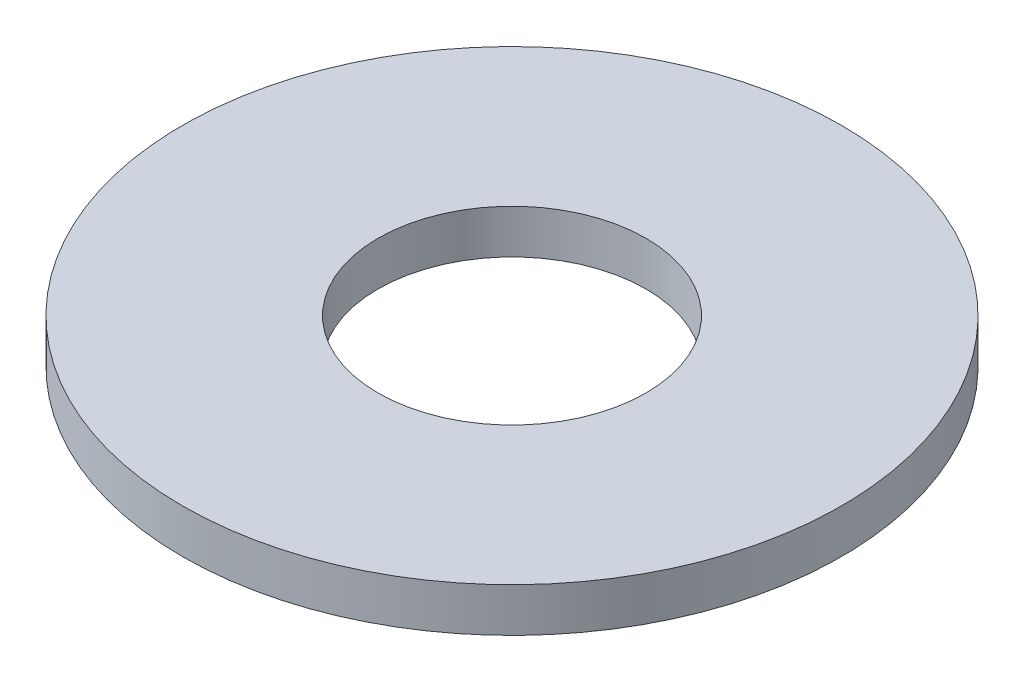
ISO-10303-21;
HEADER;
FILE_DESCRIPTION(('STEP AP214'),'2;1');
FILE_NAME('part.step','',(''),(''),'','','');
FILE_SCHEMA(('AUTOMOTIVE_DESIGN { 1 0 10303 214 1 1 1 1 }'));
ENDSEC;
DATA;
#1=APPLICATION_CONTEXT('core data for automotive mechanical design processes');
#2=APPLICATION_PROTOCOL_DEFINITION('international standard','automotive_design',2000,#1);
#3=PRODUCT_CONTEXT('',#1,'mechanical');
#4=PRODUCT('Part','Part','',(#3));
#5=PRODUCT_RELATED_PRODUCT_CATEGORY('part','',(#4));
#6=PRODUCT_DEFINITION_FORMATION('','',#4);
#7=PRODUCT_DEFINITION_CONTEXT('part definition',#1,'design');
#8=PRODUCT_DEFINITION('design','',#6,#7);
#9=PRODUCT_DEFINITION_SHAPE('','',#8);
#10=(LENGTH_UNIT() NAMED_UNIT(*) SI_UNIT(.MILLI.,.METRE.));
#11=(NAMED_UNIT(*) PLANE_ANGLE_UNIT() SI_UNIT($,.RADIAN.));
#12=(NAMED_UNIT(*) SI_UNIT($,.STERADIAN.) SOLID_ANGLE_UNIT());
#13=UNCERTAINTY_MEASURE_WITH_UNIT(LENGTH_MEASURE(1.E-05),#10,'distance_accuracy_value','');
#14=(GEOMETRIC_REPRESENTATION_CONTEXT(3) GLOBAL_UNCERTAINTY_ASSIGNED_CONTEXT((#13)) GLOBAL_UNIT_ASSIGNED_CONTEXT((#10,
#11,#12)) REPRESENTATION_CONTEXT('',''));
#15=CARTESIAN_POINT('',(0.,0.,0.));
#16=DIRECTION('',(0.,0.,1.));
#17=DIRECTION('',(1.,0.,0.));
#18=AXIS2_PLACEMENT_3D('',#15,#16,#17);
#19=CARTESIAN_POINT('',(0.,1.,0.));
#20=DIRECTION('',(0.,1.,0.));
#21=DIRECTION('',(0.,0.,1.));
#22=AXIS2_PLACEMENT_3D('',#19,#20,#21);
#23=PLANE('',#22);
#24=CARTESIAN_POINT('',(0.,1.,0.));
#25=DIRECTION('',(0.,1.,0.));
#26=DIRECTION('',(0.,0.,1.));
#27=AXIS2_PLACEMENT_3D('',#24,#25,#26);
#28=CIRCLE('',#27,7.5);
#29=CARTESIAN_POINT('',(0.,1.,7.5));
#30=VERTEX_POINT('',#29);
#31=EDGE_CURVE('E10',#30,#30,#28,.T.);
#32=ORIENTED_EDGE('',*,*,#31,.T.);
#33=EDGE_LOOP('',(#32));
#34=FACE_BOUND('',#33,.T.);
#35=CARTESIAN_POINT('',(0.,1.,0.));
#36=DIRECTION('',(0.,1.,0.));
#37=DIRECTION('',(0.,0.,1.));
#38=AXIS2_PLACEMENT_3D('',#35,#36,#37);
#39=CIRCLE('',#38,3.05);
#40=CARTESIAN_POINT('',(0.,1.,3.05));
#41=VERTEX_POINT('',#40);
#42=EDGE_CURVE('E43',#41,#41,#39,.T.);
#43=ORIENTED_EDGE('',*,*,#42,.F.);
#44=EDGE_LOOP('',(#43));
#45=FACE_BOUND('',#44,.T.);
#46=ADVANCED_FACE('F32',(#34,#45),#23,.T.);
#47=CARTESIAN_POINT('',(0.,0.,0.));
#48=DIRECTION('',(0.,1.,0.));
#49=DIRECTION('',(0.,0.,1.));
#50=AXIS2_PLACEMENT_3D('',#47,#48,#49);
#51=PLANE('',#50);
#52=CARTESIAN_POINT('',(0.,0.,0.));
#53=DIRECTION('',(0.,1.,0.));
#54=DIRECTION('',(0.,0.,1.));
#55=AXIS2_PLACEMENT_3D('',#52,#53,#54);
#56=CIRCLE('',#55,7.5);
#57=CARTESIAN_POINT('',(0.,0.,7.5));
#58=VERTEX_POINT('',#57);
#59=EDGE_CURVE('E36',#58,#58,#56,.T.);
#60=ORIENTED_EDGE('',*,*,#59,.F.);
#61=EDGE_LOOP('',(#60));
#62=FACE_BOUND('',#61,.T.);
#63=CARTESIAN_POINT('',(0.,0.,0.));
#64=DIRECTION('',(0.,1.,0.));
#65=DIRECTION('',(0.,0.,1.));
#66=AXIS2_PLACEMENT_3D('',#63,#64,#65);
#67=CIRCLE('',#66,3.05);
#68=CARTESIAN_POINT('',(0.,0.,3.05));
#69=VERTEX_POINT('',#68);
#70=EDGE_CURVE('E45',#69,#69,#67,.T.);
#71=ORIENTED_EDGE('',*,*,#70,.T.);
#72=EDGE_LOOP('',(#71));
#73=FACE_BOUND('',#72,.T.);
#74=ADVANCED_FACE('F55',(#62,#73),#51,.F.);
#75=CARTESIAN_POINT('',(0.,1.,0.));
#76=DIRECTION('',(0.,-1.,0.));
#77=DIRECTION('',(0.,0.,-1.));
#78=AXIS2_PLACEMENT_3D('',#75,#76,#77);
#79=CYLINDRICAL_SURFACE('',#78,7.5);
#80=ORIENTED_EDGE('',*,*,#31,.F.);
#81=EDGE_LOOP('',(#80));
#82=FACE_BOUND('',#81,.T.);
#83=ORIENTED_EDGE('',*,*,#59,.T.);
#84=EDGE_LOOP('',(#83));
#85=FACE_BOUND('',#84,.T.);
#86=ADVANCED_FACE('F34',(#82,#85),#79,.T.);
#87=CARTESIAN_POINT('',(0.,1.,0.));
#88=DIRECTION('',(0.,-1.,0.));
#89=DIRECTION('',(0.,0.,-1.));
#90=AXIS2_PLACEMENT_3D('',#87,#88,#89);
#91=CYLINDRICAL_SURFACE('',#90,3.05);
#92=ORIENTED_EDGE('',*,*,#42,.T.);
#93=EDGE_LOOP('',(#92));
#94=FACE_BOUND('',#93,.T.);
#95=ORIENTED_EDGE('',*,*,#70,.F.);
#96=EDGE_LOOP('',(#95));
#97=FACE_BOUND('',#96,.T.);
#98=ADVANCED_FACE('F51',(#94,#97),#91,.F.);
#99=CLOSED_SHELL('',(#46,#74,#86,#98));
#100=MANIFOLD_SOLID_BREP('B2',#99);
#101=ADVANCED_BREP_SHAPE_REPRESENTATION('',(#18,#100),#14);
#102=SHAPE_DEFINITION_REPRESENTATION(#9,#101);
ENDSEC;
END-ISO-10303-21;
